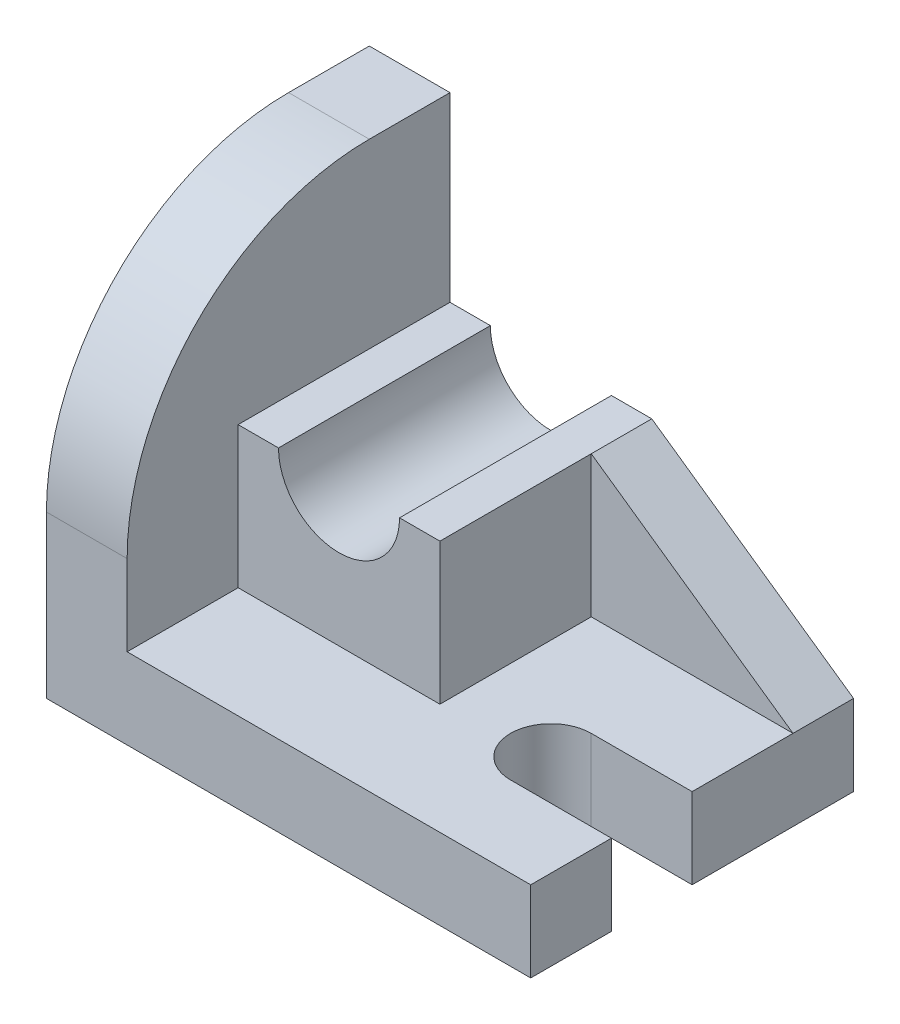
ISO-10303-21;
HEADER;
FILE_DESCRIPTION(('STEP AP214'),'2;1');
FILE_NAME('part.step','',(''),(''),'','','');
FILE_SCHEMA(('AUTOMOTIVE_DESIGN { 1 0 10303 214 1 1 1 1 }'));
ENDSEC;
DATA;
#1=APPLICATION_CONTEXT('core data for automotive mechanical design processes');
#2=APPLICATION_PROTOCOL_DEFINITION('international standard','automotive_design',2000,#1);
#3=PRODUCT_CONTEXT('',#1,'mechanical');
#4=PRODUCT('Part','Part','',(#3));
#5=PRODUCT_RELATED_PRODUCT_CATEGORY('part','',(#4));
#6=PRODUCT_DEFINITION_FORMATION('','',#4);
#7=PRODUCT_DEFINITION_CONTEXT('part definition',#1,'design');
#8=PRODUCT_DEFINITION('design','',#6,#7);
#9=PRODUCT_DEFINITION_SHAPE('','',#8);
#10=(LENGTH_UNIT() NAMED_UNIT(*) SI_UNIT(.MILLI.,.METRE.));
#11=(NAMED_UNIT(*) PLANE_ANGLE_UNIT() SI_UNIT($,.RADIAN.));
#12=(NAMED_UNIT(*) SI_UNIT($,.STERADIAN.) SOLID_ANGLE_UNIT());
#13=UNCERTAINTY_MEASURE_WITH_UNIT(LENGTH_MEASURE(1.E-05),#10,'distance_accuracy_value','');
#14=(GEOMETRIC_REPRESENTATION_CONTEXT(3) GLOBAL_UNCERTAINTY_ASSIGNED_CONTEXT((#13)) GLOBAL_UNIT_ASSIGNED_CONTEXT((#10,
#11,#12)) REPRESENTATION_CONTEXT('',''));
#15=CARTESIAN_POINT('',(0.,0.,0.));
#16=DIRECTION('',(0.,0.,1.));
#17=DIRECTION('',(1.,0.,0.));
#18=AXIS2_PLACEMENT_3D('',#15,#16,#17);
#19=CARTESIAN_POINT('',(48.,16.,-32.));
#20=DIRECTION('',(-1.,0.,0.));
#21=DIRECTION('',(0.,0.,1.));
#22=AXIS2_PLACEMENT_3D('',#19,#20,#21);
#23=PLANE('',#22);
#24=DIRECTION('',(0.,0.,-1.));
#25=VECTOR('',#24,1.);
#26=CARTESIAN_POINT('',(48.,0.,-32.));
#27=LINE('',#26,#25);
#28=CARTESIAN_POINT('',(48.,0.,32.));
#29=VERTEX_POINT('',#28);
#30=CARTESIAN_POINT('',(48.,0.,16.));
#31=VERTEX_POINT('',#30);
#32=EDGE_CURVE('E230',#29,#31,#27,.T.);
#33=ORIENTED_EDGE('',*,*,#32,.T.);
#34=DIRECTION('',(0.,1.,0.));
#35=VECTOR('',#34,1.);
#36=CARTESIAN_POINT('',(48.,0.,16.));
#37=LINE('',#36,#35);
#38=CARTESIAN_POINT('',(48.,16.,16.));
#39=VERTEX_POINT('',#38);
#40=EDGE_CURVE('E265',#31,#39,#37,.T.);
#41=ORIENTED_EDGE('',*,*,#40,.T.);
#42=DIRECTION('',(0.,0.,-1.));
#43=VECTOR('',#42,1.);
#44=CARTESIAN_POINT('',(48.,16.,-32.));
#45=LINE('',#44,#43);
#46=CARTESIAN_POINT('',(48.,16.,32.));
#47=VERTEX_POINT('',#46);
#48=EDGE_CURVE('E223',#47,#39,#45,.T.);
#49=ORIENTED_EDGE('',*,*,#48,.F.);
#50=DIRECTION('',(0.,-1.,0.));
#51=VECTOR('',#50,1.);
#52=CARTESIAN_POINT('',(48.,16.,32.));
#53=LINE('',#52,#51);
#54=EDGE_CURVE('E229',#47,#29,#53,.T.);
#55=ORIENTED_EDGE('',*,*,#54,.T.);
#56=EDGE_LOOP('',(#33,#41,#49,#55));
#57=FACE_BOUND('',#56,.T.);
#58=ADVANCED_FACE('F37',(#57),#23,.F.);
#59=CARTESIAN_POINT('',(0.,44.,0.));
#60=DIRECTION('',(0.,1.,0.));
#61=DIRECTION('',(0.,0.,1.));
#62=AXIS2_PLACEMENT_3D('',#59,#60,#61);
#63=PLANE('',#62);
#64=DIRECTION('',(0.,0.,1.));
#65=VECTOR('',#64,1.);
#66=CARTESIAN_POINT('',(-24.,44.,-32.));
#67=LINE('',#66,#65);
#68=CARTESIAN_POINT('',(-24.,44.,-32.));
#69=VERTEX_POINT('',#68);
#70=CARTESIAN_POINT('',(-24.,44.,10.));
#71=VERTEX_POINT('',#70);
#72=EDGE_CURVE('E11',#69,#71,#67,.T.);
#73=ORIENTED_EDGE('',*,*,#72,.F.);
#74=DIRECTION('',(-1.,0.,0.));
#75=VECTOR('',#74,1.);
#76=CARTESIAN_POINT('',(-32.,44.,-32.));
#77=LINE('',#76,#75);
#78=CARTESIAN_POINT('',(-32.,44.,-32.));
#79=VERTEX_POINT('',#78);
#80=EDGE_CURVE('E187',#69,#79,#77,.T.);
#81=ORIENTED_EDGE('',*,*,#80,.T.);
#82=DIRECTION('',(0.,0.,1.));
#83=VECTOR('',#82,1.);
#84=CARTESIAN_POINT('',(-32.,44.,-32.));
#85=LINE('',#84,#83);
#86=CARTESIAN_POINT('',(-32.,44.,10.));
#87=VERTEX_POINT('',#86);
#88=EDGE_CURVE('E202',#79,#87,#85,.T.);
#89=ORIENTED_EDGE('',*,*,#88,.T.);
#90=DIRECTION('',(1.,0.,0.));
#91=VECTOR('',#90,1.);
#92=CARTESIAN_POINT('',(-32.,44.,10.));
#93=LINE('',#92,#91);
#94=EDGE_CURVE('E188',#87,#71,#93,.T.);
#95=ORIENTED_EDGE('',*,*,#94,.T.);
#96=EDGE_LOOP('',(#73,#81,#89,#95));
#97=FACE_BOUND('',#96,.T.);
#98=ADVANCED_FACE('F273',(#97),#63,.T.);
#99=CARTESIAN_POINT('',(0.,16.,0.));
#100=DIRECTION('',(0.,1.,0.));
#101=DIRECTION('',(0.,0.,1.));
#102=AXIS2_PLACEMENT_3D('',#99,#100,#101);
#103=PLANE('',#102);
#104=DIRECTION('',(-1.,0.,0.));
#105=VECTOR('',#104,1.);
#106=CARTESIAN_POINT('',(8.00000000000001,16.,-20.));
#107=LINE('',#106,#105);
#108=CARTESIAN_POINT('',(48.,16.,-20.));
#109=VERTEX_POINT('',#108);
#110=CARTESIAN_POINT('',(8.00000000000001,16.,-20.));
#111=VERTEX_POINT('',#110);
#112=EDGE_CURVE('E166',#109,#111,#107,.T.);
#113=ORIENTED_EDGE('',*,*,#112,.T.);
#114=DIRECTION('',(0.,0.,-1.));
#115=VECTOR('',#114,1.);
#116=CARTESIAN_POINT('',(8.00000000000001,16.,-32.));
#117=LINE('',#116,#115);
#118=CARTESIAN_POINT('',(8.00000000000001,16.,10.));
#119=VERTEX_POINT('',#118);
#120=EDGE_CURVE('E181',#119,#111,#117,.T.);
#121=ORIENTED_EDGE('',*,*,#120,.F.);
#122=DIRECTION('',(1.,0.,0.));
#123=VECTOR('',#122,1.);
#124=CARTESIAN_POINT('',(-32.,16.,10.));
#125=LINE('',#124,#123);
#126=CARTESIAN_POINT('',(-32.,16.,10.));
#127=VERTEX_POINT('',#126);
#128=EDGE_CURVE('E197',#127,#119,#125,.T.);
#129=ORIENTED_EDGE('',*,*,#128,.F.);
#130=DIRECTION('',(0.,0.,1.));
#131=VECTOR('',#130,1.);
#132=CARTESIAN_POINT('',(-32.,16.,-32.));
#133=LINE('',#132,#131);
#134=CARTESIAN_POINT('',(-32.,16.,32.));
#135=VERTEX_POINT('',#134);
#136=EDGE_CURVE('E211',#127,#135,#133,.T.);
#137=ORIENTED_EDGE('',*,*,#136,.T.);
#138=DIRECTION('',(1.,0.,0.));
#139=VECTOR('',#138,1.);
#140=CARTESIAN_POINT('',(-48.,16.,32.));
#141=LINE('',#140,#139);
#142=EDGE_CURVE('E226',#135,#47,#141,.T.);
#143=ORIENTED_EDGE('',*,*,#142,.T.);
#144=ORIENTED_EDGE('',*,*,#48,.T.);
#145=DIRECTION('',(1.,0.,0.));
#146=VECTOR('',#145,1.);
#147=CARTESIAN_POINT('',(48.,16.,16.));
#148=LINE('',#147,#146);
#149=CARTESIAN_POINT('',(28.,16.,16.));
#150=VERTEX_POINT('',#149);
#151=EDGE_CURVE('E311',#150,#39,#148,.T.);
#152=ORIENTED_EDGE('',*,*,#151,.F.);
#153=CARTESIAN_POINT('',(28.,16.,8.));
#154=DIRECTION('',(0.,1.,0.));
#155=DIRECTION('',(0.,0.,1.));
#156=AXIS2_PLACEMENT_3D('',#153,#154,#155);
#157=CIRCLE('',#156,8.);
#158=CARTESIAN_POINT('',(28.,16.,0.));
#159=VERTEX_POINT('',#158);
#160=EDGE_CURVE('E349',#159,#150,#157,.T.);
#161=ORIENTED_EDGE('',*,*,#160,.F.);
#162=DIRECTION('',(-1.,0.,0.));
#163=VECTOR('',#162,1.);
#164=CARTESIAN_POINT('',(48.,16.,0.));
#165=LINE('',#164,#163);
#166=CARTESIAN_POINT('',(48.,16.,0.));
#167=VERTEX_POINT('',#166);
#168=EDGE_CURVE('E347',#167,#159,#165,.T.);
#169=ORIENTED_EDGE('',*,*,#168,.F.);
#170=EDGE_CURVE('E227',#167,#109,#45,.T.);
#171=ORIENTED_EDGE('',*,*,#170,.T.);
#172=EDGE_LOOP('',(#113,#121,#129,#137,#143,#144,#152,#161,#169,#171));
#173=FACE_BOUND('',#172,.T.);
#174=ADVANCED_FACE('F309',(#173),#103,.T.);
#175=CARTESIAN_POINT('',(-32.,0.,0.));
#176=DIRECTION('',(1.,0.,0.));
#177=DIRECTION('',(0.,0.,-1.));
#178=AXIS2_PLACEMENT_3D('',#175,#176,#177);
#179=PLANE('',#178);
#180=ORIENTED_EDGE('',*,*,#136,.F.);
#181=DIRECTION('',(0.,-1.,0.));
#182=VECTOR('',#181,1.);
#183=CARTESIAN_POINT('',(-32.,44.,10.));
#184=LINE('',#183,#182);
#185=EDGE_CURVE('E204',#87,#127,#184,.T.);
#186=ORIENTED_EDGE('',*,*,#185,.F.);
#187=ORIENTED_EDGE('',*,*,#88,.F.);
#188=DIRECTION('',(0.,-1.,0.));
#189=VECTOR('',#188,1.);
#190=CARTESIAN_POINT('',(-32.,16.,-32.));
#191=LINE('',#190,#189);
#192=CARTESIAN_POINT('',(-32.,80.,-32.));
#193=VERTEX_POINT('',#192);
#194=EDGE_CURVE('E208',#193,#79,#191,.T.);
#195=ORIENTED_EDGE('',*,*,#194,.F.);
#196=DIRECTION('',(0.,0.,-1.));
#197=VECTOR('',#196,1.);
#198=CARTESIAN_POINT('',(-32.,80.,-32.));
#199=LINE('',#198,#197);
#200=CARTESIAN_POINT('',(-32.,80.,-16.));
#201=VERTEX_POINT('',#200);
#202=EDGE_CURVE('E216',#201,#193,#199,.T.);
#203=ORIENTED_EDGE('',*,*,#202,.F.);
#204=CARTESIAN_POINT('',(-32.,32.,-16.));
#205=DIRECTION('',(1.,0.,0.));
#206=DIRECTION('',(0.,0.,-1.));
#207=AXIS2_PLACEMENT_3D('',#204,#205,#206);
#208=CIRCLE('',#207,48.);
#209=CARTESIAN_POINT('',(-32.,32.,32.));
#210=VERTEX_POINT('',#209);
#211=EDGE_CURVE('E257',#201,#210,#208,.T.);
#212=ORIENTED_EDGE('',*,*,#211,.T.);
#213=DIRECTION('',(0.,1.,0.));
#214=VECTOR('',#213,1.);
#215=CARTESIAN_POINT('',(-32.,16.,32.));
#216=LINE('',#215,#214);
#217=EDGE_CURVE('E213',#135,#210,#216,.T.);
#218=ORIENTED_EDGE('',*,*,#217,.F.);
#219=EDGE_LOOP('',(#180,#186,#187,#195,#203,#212,#218));
#220=FACE_BOUND('',#219,.T.);
#221=ADVANCED_FACE('F278',(#220),#179,.T.);
#222=ORIENTED_EDGE('',*,*,#170,.F.);
#223=DIRECTION('',(0.,1.,0.));
#224=VECTOR('',#223,1.);
#225=CARTESIAN_POINT('',(48.,0.,0.));
#226=LINE('',#225,#224);
#227=CARTESIAN_POINT('',(48.,0.,0.));
#228=VERTEX_POINT('',#227);
#229=EDGE_CURVE('E268',#228,#167,#226,.T.);
#230=ORIENTED_EDGE('',*,*,#229,.F.);
#231=CARTESIAN_POINT('',(48.,0.,-32.));
#232=VERTEX_POINT('',#231);
#233=EDGE_CURVE('E222',#228,#232,#27,.T.);
#234=ORIENTED_EDGE('',*,*,#233,.T.);
#235=DIRECTION('',(0.,-1.,0.));
#236=VECTOR('',#235,1.);
#237=CARTESIAN_POINT('',(48.,16.,-32.));
#238=LINE('',#237,#236);
#239=CARTESIAN_POINT('',(48.,16.,-32.));
#240=VERTEX_POINT('',#239);
#241=EDGE_CURVE('E247',#240,#232,#238,.T.);
#242=ORIENTED_EDGE('',*,*,#241,.F.);
#243=DIRECTION('',(0.,0.,-1.));
#244=VECTOR('',#243,1.);
#245=CARTESIAN_POINT('',(48.,16.,-20.));
#246=LINE('',#245,#244);
#247=EDGE_CURVE('E165',#109,#240,#246,.T.);
#248=ORIENTED_EDGE('',*,*,#247,.F.);
#249=EDGE_LOOP('',(#222,#230,#234,#242,#248));
#250=FACE_BOUND('',#249,.T.);
#251=ADVANCED_FACE('F324',(#250),#23,.F.);
#252=CARTESIAN_POINT('',(-48.,16.,-32.));
#253=DIRECTION('',(0.,0.,1.));
#254=DIRECTION('',(1.,0.,0.));
#255=AXIS2_PLACEMENT_3D('',#252,#253,#254);
#256=PLANE('',#255);
#257=ORIENTED_EDGE('',*,*,#80,.F.);
#258=CARTESIAN_POINT('',(-12.,44.,-32.));
#259=DIRECTION('',(0.,0.,1.));
#260=DIRECTION('',(1.,0.,0.));
#261=AXIS2_PLACEMENT_3D('',#258,#259,#260);
#262=CIRCLE('',#261,12.);
#263=CARTESIAN_POINT('',(0.,44.,-32.));
#264=VERTEX_POINT('',#263);
#265=EDGE_CURVE('E200',#69,#264,#262,.T.);
#266=ORIENTED_EDGE('',*,*,#265,.T.);
#267=CARTESIAN_POINT('',(8.00000000000001,44.,-32.));
#268=VERTEX_POINT('',#267);
#269=EDGE_CURVE('E190',#268,#264,#77,.T.);
#270=ORIENTED_EDGE('',*,*,#269,.F.);
#271=DIRECTION('',(0.819231920519041,-0.573462344363328,0.));
#272=VECTOR('',#271,1.);
#273=CARTESIAN_POINT('',(8.00000000000001,44.,-32.));
#274=LINE('',#273,#272);
#275=EDGE_CURVE('E160',#268,#240,#274,.T.);
#276=ORIENTED_EDGE('',*,*,#275,.T.);
#277=ORIENTED_EDGE('',*,*,#241,.T.);
#278=DIRECTION('',(-1.,0.,0.));
#279=VECTOR('',#278,1.);
#280=CARTESIAN_POINT('',(-48.,0.,-32.));
#281=LINE('',#280,#279);
#282=CARTESIAN_POINT('',(-48.,0.,-32.));
#283=VERTEX_POINT('',#282);
#284=EDGE_CURVE('E233',#232,#283,#281,.T.);
#285=ORIENTED_EDGE('',*,*,#284,.T.);
#286=DIRECTION('',(0.,-1.,0.));
#287=VECTOR('',#286,1.);
#288=CARTESIAN_POINT('',(-48.,16.,-32.));
#289=LINE('',#288,#287);
#290=CARTESIAN_POINT('',(-48.,80.,-32.));
#291=VERTEX_POINT('',#290);
#292=EDGE_CURVE('E244',#291,#283,#289,.T.);
#293=ORIENTED_EDGE('',*,*,#292,.F.);
#294=DIRECTION('',(-1.,0.,0.));
#295=VECTOR('',#294,1.);
#296=CARTESIAN_POINT('',(-32.,80.,-32.));
#297=LINE('',#296,#295);
#298=EDGE_CURVE('E218',#193,#291,#297,.T.);
#299=ORIENTED_EDGE('',*,*,#298,.F.);
#300=ORIENTED_EDGE('',*,*,#194,.T.);
#301=EDGE_LOOP('',(#257,#266,#270,#276,#277,#285,#293,#299,#300));
#302=FACE_BOUND('',#301,.T.);
#303=ADVANCED_FACE('F263',(#302),#256,.F.);
#304=CARTESIAN_POINT('',(-48.,16.,-32.));
#305=DIRECTION('',(1.,0.,0.));
#306=DIRECTION('',(0.,0.,-1.));
#307=AXIS2_PLACEMENT_3D('',#304,#305,#306);
#308=PLANE('',#307);
#309=DIRECTION('',(0.,-1.,0.));
#310=VECTOR('',#309,1.);
#311=CARTESIAN_POINT('',(-48.,16.,32.));
#312=LINE('',#311,#310);
#313=CARTESIAN_POINT('',(-48.,32.,32.));
#314=VERTEX_POINT('',#313);
#315=CARTESIAN_POINT('',(-48.,0.,32.));
#316=VERTEX_POINT('',#315);
#317=EDGE_CURVE('E242',#314,#316,#312,.T.);
#318=ORIENTED_EDGE('',*,*,#317,.F.);
#319=CARTESIAN_POINT('',(-48.,32.,-16.));
#320=DIRECTION('',(1.,0.,0.));
#321=DIRECTION('',(0.,0.,-1.));
#322=AXIS2_PLACEMENT_3D('',#319,#320,#321);
#323=CIRCLE('',#322,48.);
#324=CARTESIAN_POINT('',(-48.,80.,-16.));
#325=VERTEX_POINT('',#324);
#326=EDGE_CURVE('E253',#314,#325,#323,.F.);
#327=ORIENTED_EDGE('',*,*,#326,.T.);
#328=DIRECTION('',(0.,0.,-1.));
#329=VECTOR('',#328,1.);
#330=CARTESIAN_POINT('',(-48.,80.,-32.));
#331=LINE('',#330,#329);
#332=EDGE_CURVE('E207',#325,#291,#331,.T.);
#333=ORIENTED_EDGE('',*,*,#332,.T.);
#334=ORIENTED_EDGE('',*,*,#292,.T.);
#335=DIRECTION('',(0.,0.,1.));
#336=VECTOR('',#335,1.);
#337=CARTESIAN_POINT('',(-48.,0.,-32.));
#338=LINE('',#337,#336);
#339=EDGE_CURVE('E235',#283,#316,#338,.T.);
#340=ORIENTED_EDGE('',*,*,#339,.T.);
#341=EDGE_LOOP('',(#318,#327,#333,#334,#340));
#342=FACE_BOUND('',#341,.T.);
#343=ADVANCED_FACE('F295',(#342),#308,.F.);
#344=CARTESIAN_POINT('',(-48.,16.,32.));
#345=DIRECTION('',(0.,0.,-1.));
#346=DIRECTION('',(-1.,0.,0.));
#347=AXIS2_PLACEMENT_3D('',#344,#345,#346);
#348=PLANE('',#347);
#349=ORIENTED_EDGE('',*,*,#217,.T.);
#350=DIRECTION('',(-1.,0.,0.));
#351=VECTOR('',#350,1.);
#352=CARTESIAN_POINT('',(-48.,32.,32.));
#353=LINE('',#352,#351);
#354=EDGE_CURVE('E250',#210,#314,#353,.T.);
#355=ORIENTED_EDGE('',*,*,#354,.T.);
#356=ORIENTED_EDGE('',*,*,#317,.T.);
#357=DIRECTION('',(1.,0.,0.));
#358=VECTOR('',#357,1.);
#359=CARTESIAN_POINT('',(-48.,0.,32.));
#360=LINE('',#359,#358);
#361=EDGE_CURVE('E238',#316,#29,#360,.T.);
#362=ORIENTED_EDGE('',*,*,#361,.T.);
#363=ORIENTED_EDGE('',*,*,#54,.F.);
#364=ORIENTED_EDGE('',*,*,#142,.F.);
#365=EDGE_LOOP('',(#349,#355,#356,#362,#363,#364));
#366=FACE_BOUND('',#365,.T.);
#367=ADVANCED_FACE('F292',(#366),#348,.F.);
#368=CARTESIAN_POINT('',(0.,0.,0.));
#369=DIRECTION('',(0.,1.,0.));
#370=DIRECTION('',(0.,0.,1.));
#371=AXIS2_PLACEMENT_3D('',#368,#369,#370);
#372=PLANE('',#371);
#373=CARTESIAN_POINT('',(28.,0.,8.));
#374=DIRECTION('',(0.,1.,0.));
#375=DIRECTION('',(0.,0.,1.));
#376=AXIS2_PLACEMENT_3D('',#373,#374,#375);
#377=CIRCLE('',#376,8.);
#378=CARTESIAN_POINT('',(28.,0.,0.));
#379=VERTEX_POINT('',#378);
#380=CARTESIAN_POINT('',(28.,0.,16.));
#381=VERTEX_POINT('',#380);
#382=EDGE_CURVE('E52',#379,#381,#377,.T.);
#383=ORIENTED_EDGE('',*,*,#382,.T.);
#384=DIRECTION('',(1.,0.,0.));
#385=VECTOR('',#384,1.);
#386=CARTESIAN_POINT('',(48.,0.,16.));
#387=LINE('',#386,#385);
#388=EDGE_CURVE('E355',#381,#31,#387,.T.);
#389=ORIENTED_EDGE('',*,*,#388,.T.);
#390=ORIENTED_EDGE('',*,*,#32,.F.);
#391=ORIENTED_EDGE('',*,*,#361,.F.);
#392=ORIENTED_EDGE('',*,*,#339,.F.);
#393=ORIENTED_EDGE('',*,*,#284,.F.);
#394=ORIENTED_EDGE('',*,*,#233,.F.);
#395=DIRECTION('',(-1.,0.,0.));
#396=VECTOR('',#395,1.);
#397=CARTESIAN_POINT('',(48.,0.,0.));
#398=LINE('',#397,#396);
#399=EDGE_CURVE('E359',#228,#379,#398,.T.);
#400=ORIENTED_EDGE('',*,*,#399,.T.);
#401=EDGE_LOOP('',(#383,#389,#390,#391,#392,#393,#394,#400));
#402=FACE_BOUND('',#401,.T.);
#403=ADVANCED_FACE('F301',(#402),#372,.F.);
#404=CARTESIAN_POINT('',(-32.,80.,-32.));
#405=DIRECTION('',(0.,1.,0.));
#406=DIRECTION('',(0.,0.,1.));
#407=AXIS2_PLACEMENT_3D('',#404,#405,#406);
#408=PLANE('',#407);
#409=ORIENTED_EDGE('',*,*,#332,.F.);
#410=DIRECTION('',(-1.,0.,0.));
#411=VECTOR('',#410,1.);
#412=CARTESIAN_POINT('',(-32.,80.,-16.));
#413=LINE('',#412,#411);
#414=EDGE_CURVE('E255',#325,#201,#413,.F.);
#415=ORIENTED_EDGE('',*,*,#414,.T.);
#416=ORIENTED_EDGE('',*,*,#202,.T.);
#417=ORIENTED_EDGE('',*,*,#298,.T.);
#418=EDGE_LOOP('',(#409,#415,#416,#417));
#419=FACE_BOUND('',#418,.T.);
#420=ADVANCED_FACE('F284',(#419),#408,.T.);
#421=CARTESIAN_POINT('',(-48.,32.,-16.));
#422=DIRECTION('',(1.,0.,0.));
#423=DIRECTION('',(0.,0.,-1.));
#424=AXIS2_PLACEMENT_3D('',#421,#422,#423);
#425=CYLINDRICAL_SURFACE('',#424,48.);
#426=ORIENTED_EDGE('',*,*,#211,.F.);
#427=ORIENTED_EDGE('',*,*,#414,.F.);
#428=ORIENTED_EDGE('',*,*,#326,.F.);
#429=ORIENTED_EDGE('',*,*,#354,.F.);
#430=EDGE_LOOP('',(#426,#427,#428,#429));
#431=FACE_BOUND('',#430,.T.);
#432=ADVANCED_FACE('F39',(#431),#425,.T.);
#433=CARTESIAN_POINT('',(-32.,44.,10.));
#434=DIRECTION('',(0.,0.,-1.));
#435=DIRECTION('',(-1.,0.,0.));
#436=AXIS2_PLACEMENT_3D('',#433,#434,#435);
#437=PLANE('',#436);
#438=CARTESIAN_POINT('',(0.,44.,10.));
#439=VERTEX_POINT('',#438);
#440=CARTESIAN_POINT('',(8.00000000000001,44.,10.));
#441=VERTEX_POINT('',#440);
#442=EDGE_CURVE('E185',#439,#441,#93,.T.);
#443=ORIENTED_EDGE('',*,*,#442,.F.);
#444=CARTESIAN_POINT('',(-12.,44.,10.));
#445=DIRECTION('',(0.,0.,1.));
#446=DIRECTION('',(1.,0.,0.));
#447=AXIS2_PLACEMENT_3D('',#444,#445,#446);
#448=CIRCLE('',#447,12.);
#449=EDGE_CURVE('E59',#71,#439,#448,.T.);
#450=ORIENTED_EDGE('',*,*,#449,.F.);
#451=ORIENTED_EDGE('',*,*,#94,.F.);
#452=ORIENTED_EDGE('',*,*,#185,.T.);
#453=ORIENTED_EDGE('',*,*,#128,.T.);
#454=DIRECTION('',(0.,-1.,0.));
#455=VECTOR('',#454,1.);
#456=CARTESIAN_POINT('',(8.00000000000001,44.,10.));
#457=LINE('',#456,#455);
#458=EDGE_CURVE('E196',#441,#119,#457,.T.);
#459=ORIENTED_EDGE('',*,*,#458,.F.);
#460=EDGE_LOOP('',(#443,#450,#451,#452,#453,#459));
#461=FACE_BOUND('',#460,.T.);
#462=ADVANCED_FACE('F313',(#461),#437,.F.);
#463=CARTESIAN_POINT('',(8.00000000000001,44.,-32.));
#464=DIRECTION('',(-1.,0.,0.));
#465=DIRECTION('',(0.,0.,1.));
#466=AXIS2_PLACEMENT_3D('',#463,#464,#465);
#467=PLANE('',#466);
#468=ORIENTED_EDGE('',*,*,#120,.T.);
#469=DIRECTION('',(0.,1.,0.));
#470=VECTOR('',#469,1.);
#471=CARTESIAN_POINT('',(8.00000000000001,44.,-20.));
#472=LINE('',#471,#470);
#473=CARTESIAN_POINT('',(8.00000000000001,44.,-20.));
#474=VERTEX_POINT('',#473);
#475=EDGE_CURVE('E171',#111,#474,#472,.T.);
#476=ORIENTED_EDGE('',*,*,#475,.T.);
#477=DIRECTION('',(0.,0.,-1.));
#478=VECTOR('',#477,1.);
#479=CARTESIAN_POINT('',(8.00000000000001,44.,-32.));
#480=LINE('',#479,#478);
#481=EDGE_CURVE('E180',#441,#474,#480,.T.);
#482=ORIENTED_EDGE('',*,*,#481,.F.);
#483=ORIENTED_EDGE('',*,*,#458,.T.);
#484=EDGE_LOOP('',(#468,#476,#482,#483));
#485=FACE_BOUND('',#484,.T.);
#486=ADVANCED_FACE('F178',(#485),#467,.F.);
#487=DIRECTION('',(0.,0.,1.));
#488=VECTOR('',#487,1.);
#489=CARTESIAN_POINT('',(0.,44.,-32.));
#490=LINE('',#489,#488);
#491=EDGE_CURVE('E45',#439,#264,#490,.F.);
#492=ORIENTED_EDGE('',*,*,#491,.F.);
#493=ORIENTED_EDGE('',*,*,#442,.T.);
#494=ORIENTED_EDGE('',*,*,#481,.T.);
#495=DIRECTION('',(0.,0.,-1.));
#496=VECTOR('',#495,1.);
#497=CARTESIAN_POINT('',(8.00000000000001,44.,-20.));
#498=LINE('',#497,#496);
#499=EDGE_CURVE('E154',#474,#268,#498,.T.);
#500=ORIENTED_EDGE('',*,*,#499,.T.);
#501=ORIENTED_EDGE('',*,*,#269,.T.);
#502=EDGE_LOOP('',(#492,#493,#494,#500,#501));
#503=FACE_BOUND('',#502,.T.);
#504=ADVANCED_FACE('F183',(#503),#63,.T.);
#505=CARTESIAN_POINT('',(-12.,44.,-32.));
#506=DIRECTION('',(0.,0.,1.));
#507=DIRECTION('',(1.,0.,0.));
#508=AXIS2_PLACEMENT_3D('',#505,#506,#507);
#509=CYLINDRICAL_SURFACE('',#508,12.);
#510=ORIENTED_EDGE('',*,*,#72,.T.);
#511=ORIENTED_EDGE('',*,*,#449,.T.);
#512=ORIENTED_EDGE('',*,*,#491,.T.);
#513=ORIENTED_EDGE('',*,*,#265,.F.);
#514=EDGE_LOOP('',(#510,#511,#512,#513));
#515=FACE_BOUND('',#514,.T.);
#516=ADVANCED_FACE('F259',(#515),#509,.F.);
#517=CARTESIAN_POINT('',(48.,0.,16.));
#518=DIRECTION('',(0.,0.,1.));
#519=DIRECTION('',(1.,0.,0.));
#520=AXIS2_PLACEMENT_3D('',#517,#518,#519);
#521=PLANE('',#520);
#522=ORIENTED_EDGE('',*,*,#151,.T.);
#523=ORIENTED_EDGE('',*,*,#40,.F.);
#524=ORIENTED_EDGE('',*,*,#388,.F.);
#525=DIRECTION('',(0.,1.,0.));
#526=VECTOR('',#525,1.);
#527=CARTESIAN_POINT('',(28.,0.,16.));
#528=LINE('',#527,#526);
#529=EDGE_CURVE('E361',#381,#150,#528,.T.);
#530=ORIENTED_EDGE('',*,*,#529,.T.);
#531=EDGE_LOOP('',(#522,#523,#524,#530));
#532=FACE_BOUND('',#531,.T.);
#533=ADVANCED_FACE('F377',(#532),#521,.F.);
#534=CARTESIAN_POINT('',(28.,0.,8.));
#535=DIRECTION('',(0.,1.,0.));
#536=DIRECTION('',(0.,0.,1.));
#537=AXIS2_PLACEMENT_3D('',#534,#535,#536);
#538=CYLINDRICAL_SURFACE('',#537,8.);
#539=ORIENTED_EDGE('',*,*,#160,.T.);
#540=ORIENTED_EDGE('',*,*,#529,.F.);
#541=ORIENTED_EDGE('',*,*,#382,.F.);
#542=DIRECTION('',(0.,1.,0.));
#543=VECTOR('',#542,1.);
#544=CARTESIAN_POINT('',(28.,0.,0.));
#545=LINE('',#544,#543);
#546=EDGE_CURVE('E362',#379,#159,#545,.T.);
#547=ORIENTED_EDGE('',*,*,#546,.T.);
#548=EDGE_LOOP('',(#539,#540,#541,#547));
#549=FACE_BOUND('',#548,.T.);
#550=ADVANCED_FACE('F370',(#549),#538,.F.);
#551=CARTESIAN_POINT('',(48.,0.,0.));
#552=DIRECTION('',(0.,0.,-1.));
#553=DIRECTION('',(-1.,0.,0.));
#554=AXIS2_PLACEMENT_3D('',#551,#552,#553);
#555=PLANE('',#554);
#556=ORIENTED_EDGE('',*,*,#168,.T.);
#557=ORIENTED_EDGE('',*,*,#546,.F.);
#558=ORIENTED_EDGE('',*,*,#399,.F.);
#559=ORIENTED_EDGE('',*,*,#229,.T.);
#560=EDGE_LOOP('',(#556,#557,#558,#559));
#561=FACE_BOUND('',#560,.T.);
#562=ADVANCED_FACE('F368',(#561),#555,.F.);
#563=CARTESIAN_POINT('',(8.00000000000001,44.,-20.));
#564=DIRECTION('',(0.573462344363328,0.81923192051904,0.));
#565=DIRECTION('',(-0.819231920519041,0.573462344363328,0.));
#566=AXIS2_PLACEMENT_3D('',#563,#564,#565);
#567=PLANE('',#566);
#568=ORIENTED_EDGE('',*,*,#275,.F.);
#569=ORIENTED_EDGE('',*,*,#499,.F.);
#570=DIRECTION('',(0.819231920519041,-0.573462344363328,0.));
#571=VECTOR('',#570,1.);
#572=CARTESIAN_POINT('',(8.00000000000001,44.,-20.));
#573=LINE('',#572,#571);
#574=EDGE_CURVE('E157',#474,#109,#573,.T.);
#575=ORIENTED_EDGE('',*,*,#574,.T.);
#576=ORIENTED_EDGE('',*,*,#247,.T.);
#577=EDGE_LOOP('',(#568,#569,#575,#576));
#578=FACE_BOUND('',#577,.T.);
#579=ADVANCED_FACE('F156',(#578),#567,.T.);
#580=CARTESIAN_POINT('',(0.,0.,-20.));
#581=DIRECTION('',(0.,0.,1.));
#582=DIRECTION('',(1.,0.,0.));
#583=AXIS2_PLACEMENT_3D('',#580,#581,#582);
#584=PLANE('',#583);
#585=ORIENTED_EDGE('',*,*,#475,.F.);
#586=ORIENTED_EDGE('',*,*,#112,.F.);
#587=ORIENTED_EDGE('',*,*,#574,.F.);
#588=EDGE_LOOP('',(#585,#586,#587));
#589=FACE_BOUND('',#588,.T.);
#590=ADVANCED_FACE('F170',(#589),#584,.T.);
#591=CLOSED_SHELL('',(#58,#98,#174,#221,#251,#303,#343,#367,#403,#420,#432,#462,#486,#504,#516,
#533,#550,#562,#579,#590));
#592=MANIFOLD_SOLID_BREP('B2',#591);
#593=ADVANCED_BREP_SHAPE_REPRESENTATION('',(#18,#592),#14);
#594=SHAPE_DEFINITION_REPRESENTATION(#9,#593);
ENDSEC;
END-ISO-10303-21;
